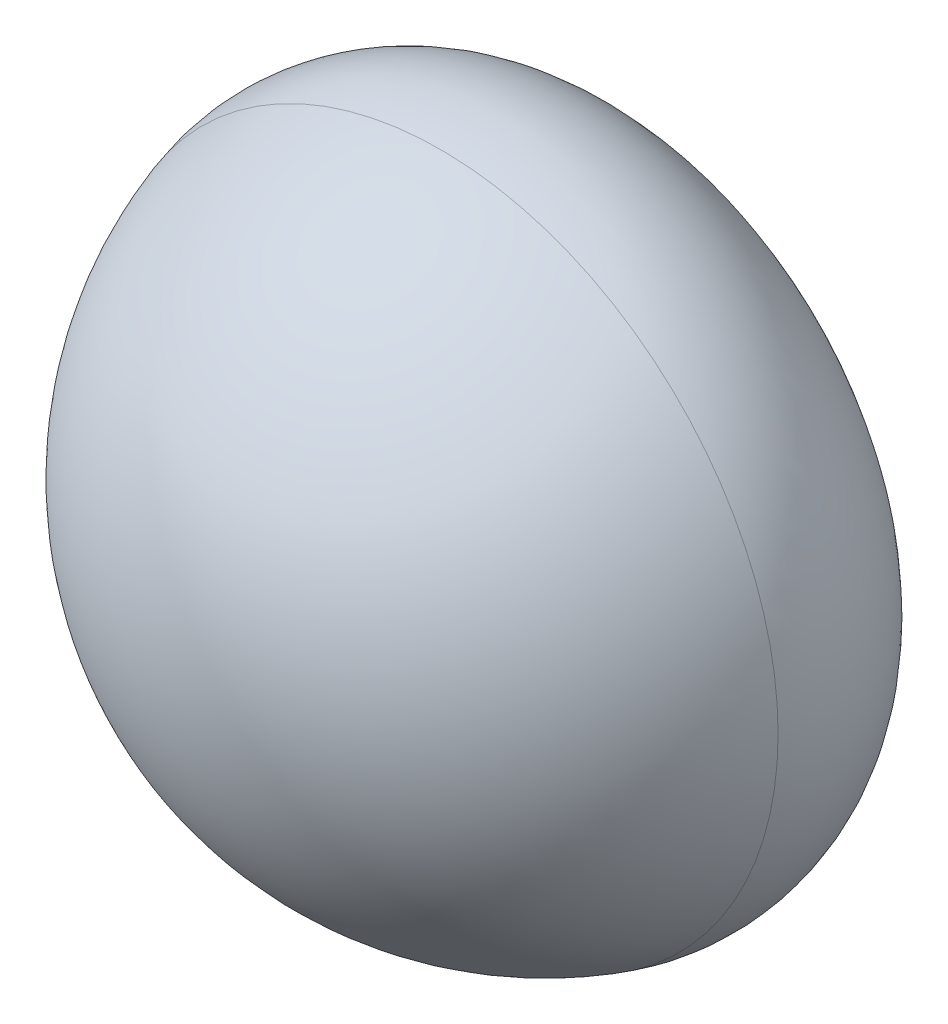
ISO-10303-21;
HEADER;
FILE_DESCRIPTION(('STEP AP214'),'2;1');
FILE_NAME('part.step','',(''),(''),'','','');
FILE_SCHEMA(('AUTOMOTIVE_DESIGN { 1 0 10303 214 1 1 1 1 }'));
ENDSEC;
DATA;
#1=APPLICATION_CONTEXT('core data for automotive mechanical design processes');
#2=APPLICATION_PROTOCOL_DEFINITION('international standard','automotive_design',2000,#1);
#3=PRODUCT_CONTEXT('',#1,'mechanical');
#4=PRODUCT('Part','Part','',(#3));
#5=PRODUCT_RELATED_PRODUCT_CATEGORY('part','',(#4));
#6=PRODUCT_DEFINITION_FORMATION('','',#4);
#7=PRODUCT_DEFINITION_CONTEXT('part definition',#1,'design');
#8=PRODUCT_DEFINITION('design','',#6,#7);
#9=PRODUCT_DEFINITION_SHAPE('','',#8);
#10=(LENGTH_UNIT() NAMED_UNIT(*) SI_UNIT(.MILLI.,.METRE.));
#11=(NAMED_UNIT(*) PLANE_ANGLE_UNIT() SI_UNIT($,.RADIAN.));
#12=(NAMED_UNIT(*) SI_UNIT($,.STERADIAN.) SOLID_ANGLE_UNIT());
#13=UNCERTAINTY_MEASURE_WITH_UNIT(LENGTH_MEASURE(1.E-05),#10,'distance_accuracy_value','');
#14=(GEOMETRIC_REPRESENTATION_CONTEXT(3) GLOBAL_UNCERTAINTY_ASSIGNED_CONTEXT((#13)) GLOBAL_UNIT_ASSIGNED_CONTEXT((#10,
#11,#12)) REPRESENTATION_CONTEXT('',''));
#15=CARTESIAN_POINT('',(0.,0.,0.));
#16=DIRECTION('',(0.,0.,1.));
#17=DIRECTION('',(1.,0.,0.));
#18=AXIS2_PLACEMENT_3D('',#15,#16,#17);
#19=CARTESIAN_POINT('',(0.,0.,85.9488743265488));
#20=DIRECTION('',(0.,0.,1.));
#21=DIRECTION('',(1.,0.,0.));
#22=AXIS2_PLACEMENT_3D('',#19,#20,#21);
#23=SPHERICAL_SURFACE('',#22,7.08);
#24=CARTESIAN_POINT('',(0.,0.,80.0405516232589));
#25=DIRECTION('',(0.,0.,1.));
#26=DIRECTION('',(1.,0.,0.));
#27=AXIS2_PLACEMENT_3D('',#24,#25,#26);
#28=CIRCLE('',#27,3.90104124994714);
#29=CARTESIAN_POINT('',(3.90104124994714,0.,80.0405516232589));
#30=VERTEX_POINT('',#29);
#31=EDGE_CURVE('E10',#30,#30,#28,.T.);
#32=ORIENTED_EDGE('',*,*,#31,.F.);
#33=EDGE_LOOP('',(#32));
#34=FACE_BOUND('',#33,.T.);
#35=ADVANCED_FACE('F39',(#34),#23,.T.);
#36=CARTESIAN_POINT('',(0.,0.,82.0016474357935));
#37=DIRECTION('',(0.,0.,1.));
#38=DIRECTION('',(1.,0.,0.));
#39=AXIS2_PLACEMENT_3D('',#36,#37,#38);
#40=TOROIDAL_SURFACE('',#39,2.60620411189847,2.35000000000225);
#41=ORIENTED_EDGE('',*,*,#31,.T.);
#42=EDGE_LOOP('',(#41));
#43=FACE_BOUND('',#42,.T.);
#44=CARTESIAN_POINT('',(0.,0.,82.7012872917379));
#45=DIRECTION('',(0.,0.,1.));
#46=DIRECTION('',(1.,0.,0.));
#47=AXIS2_PLACEMENT_3D('',#44,#45,#46);
#48=CIRCLE('',#47,4.84963988588101);
#49=CARTESIAN_POINT('',(4.84963988588101,0.,82.7012872917379));
#50=VERTEX_POINT('',#49);
#51=EDGE_CURVE('E45',#50,#50,#48,.T.);
#52=ORIENTED_EDGE('',*,*,#51,.F.);
#53=EDGE_LOOP('',(#52));
#54=FACE_BOUND('',#53,.T.);
#55=ADVANCED_FACE('F53',(#43,#54),#40,.T.);
#56=CARTESIAN_POINT('',(0.,0.,81.1888743265488));
#57=DIRECTION('',(0.,0.,1.));
#58=DIRECTION('',(1.,0.,0.));
#59=AXIS2_PLACEMENT_3D('',#56,#57,#58);
#60=SPHERICAL_SURFACE('',#59,5.08);
#61=ORIENTED_EDGE('',*,*,#51,.T.);
#62=EDGE_LOOP('',(#61));
#63=FACE_BOUND('',#62,.T.);
#64=ADVANCED_FACE('F51',(#63),#60,.T.);
#65=CLOSED_SHELL('',(#35,#55,#64));
#66=MANIFOLD_SOLID_BREP('B2',#65);
#67=ADVANCED_BREP_SHAPE_REPRESENTATION('',(#18,#66),#14);
#68=SHAPE_DEFINITION_REPRESENTATION(#9,#67);
ENDSEC;
END-ISO-10303-21;
